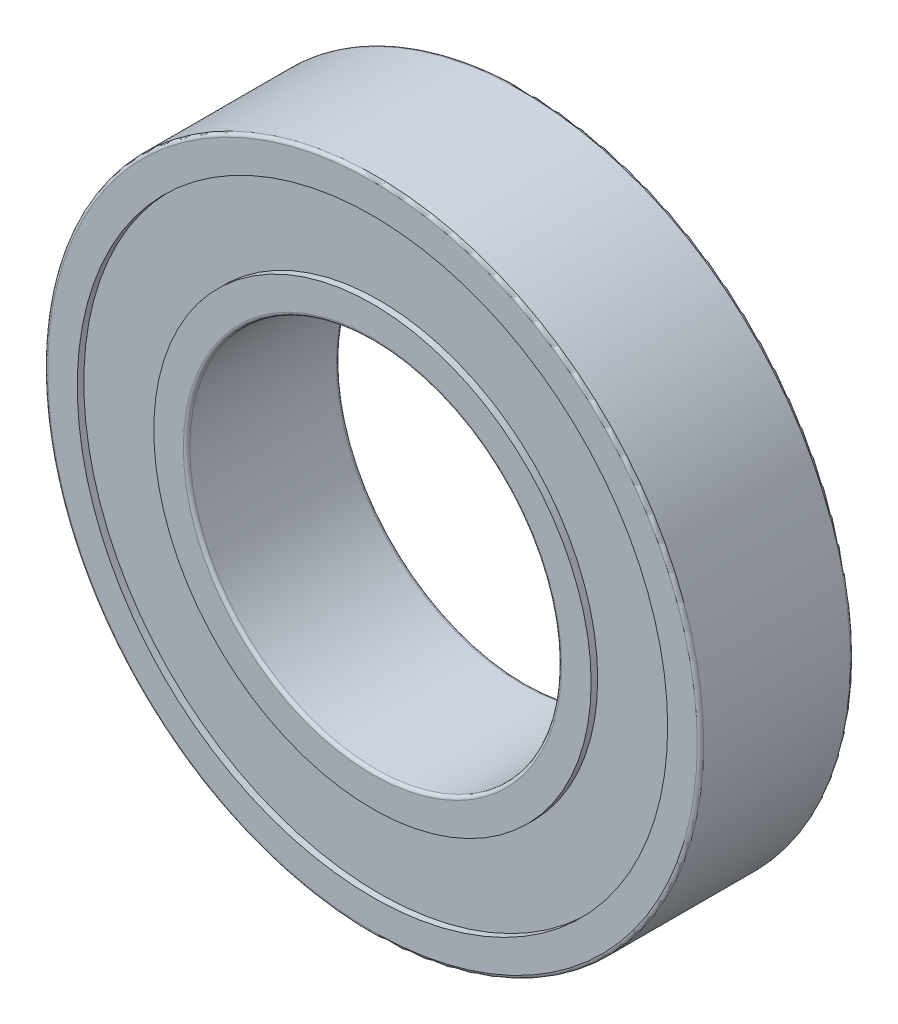
ISO-10303-21;
HEADER;
FILE_DESCRIPTION(('STEP AP214'),'2;1');
FILE_NAME('part.step','',(''),(''),'','','');
FILE_SCHEMA(('AUTOMOTIVE_DESIGN { 1 0 10303 214 1 1 1 1 }'));
ENDSEC;
DATA;
#1=APPLICATION_CONTEXT('core data for automotive mechanical design processes');
#2=APPLICATION_PROTOCOL_DEFINITION('international standard','automotive_design',2000,#1);
#3=PRODUCT_CONTEXT('',#1,'mechanical');
#4=PRODUCT('Part','Part','',(#3));
#5=PRODUCT_RELATED_PRODUCT_CATEGORY('part','',(#4));
#6=PRODUCT_DEFINITION_FORMATION('','',#4);
#7=PRODUCT_DEFINITION_CONTEXT('part definition',#1,'design');
#8=PRODUCT_DEFINITION('design','',#6,#7);
#9=PRODUCT_DEFINITION_SHAPE('','',#8);
#10=(LENGTH_UNIT() NAMED_UNIT(*) SI_UNIT(.MILLI.,.METRE.));
#11=(NAMED_UNIT(*) PLANE_ANGLE_UNIT() SI_UNIT($,.RADIAN.));
#12=(NAMED_UNIT(*) SI_UNIT($,.STERADIAN.) SOLID_ANGLE_UNIT());
#13=UNCERTAINTY_MEASURE_WITH_UNIT(LENGTH_MEASURE(1.E-05),#10,'distance_accuracy_value','');
#14=(GEOMETRIC_REPRESENTATION_CONTEXT(3) GLOBAL_UNCERTAINTY_ASSIGNED_CONTEXT((#13)) GLOBAL_UNIT_ASSIGNED_CONTEXT((#10,
#11,#12)) REPRESENTATION_CONTEXT('',''));
#15=CARTESIAN_POINT('',(0.,0.,0.));
#16=DIRECTION('',(0.,0.,1.));
#17=DIRECTION('',(1.,0.,0.));
#18=AXIS2_PLACEMENT_3D('',#15,#16,#17);
#19=CARTESIAN_POINT('',(0.,0.,0.));
#20=DIRECTION('',(0.,0.,1.));
#21=DIRECTION('',(1.,0.,0.));
#22=AXIS2_PLACEMENT_3D('',#19,#20,#21);
#23=PLANE('',#22);
#24=CARTESIAN_POINT('',(0.,0.,0.));
#25=DIRECTION('',(0.,0.,1.));
#26=DIRECTION('',(1.,0.,0.));
#27=AXIS2_PLACEMENT_3D('',#24,#25,#26);
#28=CIRCLE('',#27,8.65);
#29=CARTESIAN_POINT('',(8.65,0.,0.));
#30=VERTEX_POINT('',#29);
#31=EDGE_CURVE('E62',#30,#30,#28,.T.);
#32=ORIENTED_EDGE('',*,*,#31,.T.);
#33=EDGE_LOOP('',(#32));
#34=FACE_BOUND('',#33,.T.);
#35=CARTESIAN_POINT('',(0.,0.,0.));
#36=DIRECTION('',(0.,0.,1.));
#37=DIRECTION('',(1.,0.,0.));
#38=AXIS2_PLACEMENT_3D('',#35,#36,#37);
#39=CIRCLE('',#38,10.);
#40=CARTESIAN_POINT('',(10.,0.,0.));
#41=VERTEX_POINT('',#40);
#42=EDGE_CURVE('E84',#41,#41,#39,.T.);
#43=ORIENTED_EDGE('',*,*,#42,.F.);
#44=EDGE_LOOP('',(#43));
#45=FACE_BOUND('',#44,.T.);
#46=ADVANCED_FACE('F33',(#34,#45),#23,.F.);
#47=CARTESIAN_POINT('',(0.,0.,7.));
#48=DIRECTION('',(0.,0.,1.));
#49=DIRECTION('',(1.,0.,0.));
#50=AXIS2_PLACEMENT_3D('',#47,#48,#49);
#51=PLANE('',#50);
#52=CARTESIAN_POINT('',(0.,0.,7.));
#53=DIRECTION('',(0.,0.,1.));
#54=DIRECTION('',(1.,0.,0.));
#55=AXIS2_PLACEMENT_3D('',#52,#53,#54);
#56=CIRCLE('',#55,8.65);
#57=CARTESIAN_POINT('',(8.65,0.,7.));
#58=VERTEX_POINT('',#57);
#59=EDGE_CURVE('E40',#58,#58,#56,.F.);
#60=ORIENTED_EDGE('',*,*,#59,.T.);
#61=EDGE_LOOP('',(#60));
#62=FACE_BOUND('',#61,.T.);
#63=CARTESIAN_POINT('',(0.,0.,7.));
#64=DIRECTION('',(0.,0.,1.));
#65=DIRECTION('',(1.,0.,0.));
#66=AXIS2_PLACEMENT_3D('',#63,#64,#65);
#67=CIRCLE('',#66,10.);
#68=CARTESIAN_POINT('',(10.,0.,7.));
#69=VERTEX_POINT('',#68);
#70=EDGE_CURVE('E72',#69,#69,#67,.T.);
#71=ORIENTED_EDGE('',*,*,#70,.T.);
#72=EDGE_LOOP('',(#71));
#73=FACE_BOUND('',#72,.T.);
#74=ADVANCED_FACE('F101',(#62,#73),#51,.T.);
#75=CARTESIAN_POINT('',(0.,0.,7.));
#76=DIRECTION('',(0.,0.,1.));
#77=DIRECTION('',(1.,0.,0.));
#78=AXIS2_PLACEMENT_3D('',#75,#76,#77);
#79=CIRCLE('',#78,14.85);
#80=CARTESIAN_POINT('',(14.85,0.,7.));
#81=VERTEX_POINT('',#80);
#82=EDGE_CURVE('E10',#81,#81,#79,.T.);
#83=ORIENTED_EDGE('',*,*,#82,.T.);
#84=EDGE_LOOP('',(#83));
#85=FACE_BOUND('',#84,.T.);
#86=CARTESIAN_POINT('',(0.,0.,7.));
#87=DIRECTION('',(0.,0.,1.));
#88=DIRECTION('',(1.,0.,0.));
#89=AXIS2_PLACEMENT_3D('',#86,#87,#88);
#90=CIRCLE('',#89,13.5);
#91=CARTESIAN_POINT('',(13.5,0.,7.));
#92=VERTEX_POINT('',#91);
#93=EDGE_CURVE('E66',#92,#92,#90,.T.);
#94=ORIENTED_EDGE('',*,*,#93,.F.);
#95=EDGE_LOOP('',(#94));
#96=FACE_BOUND('',#95,.T.);
#97=ADVANCED_FACE('F108',(#85,#96),#51,.T.);
#98=CARTESIAN_POINT('',(0.,0.,0.));
#99=DIRECTION('',(0.,0.,1.));
#100=DIRECTION('',(1.,0.,0.));
#101=AXIS2_PLACEMENT_3D('',#98,#99,#100);
#102=CIRCLE('',#101,14.85);
#103=CARTESIAN_POINT('',(14.85,0.,0.));
#104=VERTEX_POINT('',#103);
#105=EDGE_CURVE('E44',#104,#104,#102,.F.);
#106=ORIENTED_EDGE('',*,*,#105,.T.);
#107=EDGE_LOOP('',(#106));
#108=FACE_BOUND('',#107,.T.);
#109=CARTESIAN_POINT('',(0.,0.,0.));
#110=DIRECTION('',(0.,0.,1.));
#111=DIRECTION('',(1.,0.,0.));
#112=AXIS2_PLACEMENT_3D('',#109,#110,#111);
#113=CIRCLE('',#112,13.5);
#114=CARTESIAN_POINT('',(13.5,0.,0.));
#115=VERTEX_POINT('',#114);
#116=EDGE_CURVE('E78',#115,#115,#113,.T.);
#117=ORIENTED_EDGE('',*,*,#116,.T.);
#118=EDGE_LOOP('',(#117));
#119=FACE_BOUND('',#118,.T.);
#120=ADVANCED_FACE('F104',(#108,#119),#23,.F.);
#121=CARTESIAN_POINT('',(0.,0.,7.));
#122=DIRECTION('',(0.,0.,-1.));
#123=DIRECTION('',(-1.,0.,0.));
#124=AXIS2_PLACEMENT_3D('',#121,#122,#123);
#125=CYLINDRICAL_SURFACE('',#124,15.);
#126=CARTESIAN_POINT('',(0.,0.,0.15));
#127=DIRECTION('',(0.,0.,1.));
#128=DIRECTION('',(1.,0.,0.));
#129=AXIS2_PLACEMENT_3D('',#126,#127,#128);
#130=CIRCLE('',#129,15.);
#131=CARTESIAN_POINT('',(15.,0.,0.15));
#132=VERTEX_POINT('',#131);
#133=EDGE_CURVE('E48',#132,#132,#130,.T.);
#134=ORIENTED_EDGE('',*,*,#133,.T.);
#135=EDGE_LOOP('',(#134));
#136=FACE_BOUND('',#135,.T.);
#137=CARTESIAN_POINT('',(0.,0.,6.85));
#138=DIRECTION('',(0.,0.,1.));
#139=DIRECTION('',(1.,0.,0.));
#140=AXIS2_PLACEMENT_3D('',#137,#138,#139);
#141=CIRCLE('',#140,15.);
#142=CARTESIAN_POINT('',(15.,0.,6.85));
#143=VERTEX_POINT('',#142);
#144=EDGE_CURVE('E53',#143,#143,#141,.F.);
#145=ORIENTED_EDGE('',*,*,#144,.T.);
#146=EDGE_LOOP('',(#145));
#147=FACE_BOUND('',#146,.T.);
#148=ADVANCED_FACE('F112',(#136,#147),#125,.T.);
#149=CARTESIAN_POINT('',(0.,0.,7.));
#150=DIRECTION('',(0.,0.,-1.));
#151=DIRECTION('',(-1.,0.,0.));
#152=AXIS2_PLACEMENT_3D('',#149,#150,#151);
#153=CYLINDRICAL_SURFACE('',#152,8.5);
#154=CARTESIAN_POINT('',(0.,0.,0.15));
#155=DIRECTION('',(0.,0.,1.));
#156=DIRECTION('',(1.,0.,0.));
#157=AXIS2_PLACEMENT_3D('',#154,#155,#156);
#158=CIRCLE('',#157,8.5);
#159=CARTESIAN_POINT('',(8.5,0.,0.15));
#160=VERTEX_POINT('',#159);
#161=EDGE_CURVE('E56',#160,#160,#158,.F.);
#162=ORIENTED_EDGE('',*,*,#161,.T.);
#163=EDGE_LOOP('',(#162));
#164=FACE_BOUND('',#163,.T.);
#165=CARTESIAN_POINT('',(0.,0.,6.85));
#166=DIRECTION('',(0.,0.,1.));
#167=DIRECTION('',(1.,0.,0.));
#168=AXIS2_PLACEMENT_3D('',#165,#166,#167);
#169=CIRCLE('',#168,8.5);
#170=CARTESIAN_POINT('',(8.5,0.,6.85));
#171=VERTEX_POINT('',#170);
#172=EDGE_CURVE('E59',#171,#171,#169,.T.);
#173=ORIENTED_EDGE('',*,*,#172,.T.);
#174=EDGE_LOOP('',(#173));
#175=FACE_BOUND('',#174,.T.);
#176=ADVANCED_FACE('F118',(#164,#175),#153,.F.);
#177=CARTESIAN_POINT('',(0.,0.,6.7));
#178=DIRECTION('',(0.,0.,1.));
#179=DIRECTION('',(1.,0.,0.));
#180=AXIS2_PLACEMENT_3D('',#177,#178,#179);
#181=CYLINDRICAL_SURFACE('',#180,13.5);
#182=CARTESIAN_POINT('',(0.,0.,6.7));
#183=DIRECTION('',(0.,0.,1.));
#184=DIRECTION('',(1.,0.,0.));
#185=AXIS2_PLACEMENT_3D('',#182,#183,#184);
#186=CIRCLE('',#185,13.5);
#187=CARTESIAN_POINT('',(13.5,0.,6.7));
#188=VERTEX_POINT('',#187);
#189=EDGE_CURVE('E65',#188,#188,#186,.T.);
#190=ORIENTED_EDGE('',*,*,#189,.F.);
#191=EDGE_LOOP('',(#190));
#192=FACE_BOUND('',#191,.T.);
#193=ORIENTED_EDGE('',*,*,#93,.T.);
#194=EDGE_LOOP('',(#193));
#195=FACE_BOUND('',#194,.T.);
#196=ADVANCED_FACE('F140',(#192,#195),#181,.F.);
#197=CARTESIAN_POINT('',(0.,0.,6.7));
#198=DIRECTION('',(0.,0.,1.));
#199=DIRECTION('',(1.,0.,0.));
#200=AXIS2_PLACEMENT_3D('',#197,#198,#199);
#201=PLANE('',#200);
#202=CARTESIAN_POINT('',(0.,0.,6.7));
#203=DIRECTION('',(0.,0.,1.));
#204=DIRECTION('',(1.,0.,0.));
#205=AXIS2_PLACEMENT_3D('',#202,#203,#204);
#206=CIRCLE('',#205,10.);
#207=CARTESIAN_POINT('',(10.,0.,6.7));
#208=VERTEX_POINT('',#207);
#209=EDGE_CURVE('E69',#208,#208,#206,.T.);
#210=ORIENTED_EDGE('',*,*,#209,.F.);
#211=EDGE_LOOP('',(#210));
#212=FACE_BOUND('',#211,.T.);
#213=ORIENTED_EDGE('',*,*,#189,.T.);
#214=EDGE_LOOP('',(#213));
#215=FACE_BOUND('',#214,.T.);
#216=ADVANCED_FACE('F136',(#212,#215),#201,.T.);
#217=CARTESIAN_POINT('',(0.,0.,6.7));
#218=DIRECTION('',(0.,0.,1.));
#219=DIRECTION('',(1.,0.,0.));
#220=AXIS2_PLACEMENT_3D('',#217,#218,#219);
#221=CYLINDRICAL_SURFACE('',#220,10.);
#222=ORIENTED_EDGE('',*,*,#209,.T.);
#223=EDGE_LOOP('',(#222));
#224=FACE_BOUND('',#223,.T.);
#225=ORIENTED_EDGE('',*,*,#70,.F.);
#226=EDGE_LOOP('',(#225));
#227=FACE_BOUND('',#226,.T.);
#228=ADVANCED_FACE('F130',(#224,#227),#221,.T.);
#229=CARTESIAN_POINT('',(0.,0.,0.5));
#230=DIRECTION('',(0.,0.,1.));
#231=DIRECTION('',(1.,0.,0.));
#232=AXIS2_PLACEMENT_3D('',#229,#230,#231);
#233=PLANE('',#232);
#234=CARTESIAN_POINT('',(0.,0.,0.5));
#235=DIRECTION('',(0.,0.,1.));
#236=DIRECTION('',(1.,0.,0.));
#237=AXIS2_PLACEMENT_3D('',#234,#235,#236);
#238=CIRCLE('',#237,13.5);
#239=CARTESIAN_POINT('',(13.5,0.,0.5));
#240=VERTEX_POINT('',#239);
#241=EDGE_CURVE('E75',#240,#240,#238,.T.);
#242=ORIENTED_EDGE('',*,*,#241,.F.);
#243=EDGE_LOOP('',(#242));
#244=FACE_BOUND('',#243,.T.);
#245=CARTESIAN_POINT('',(0.,0.,0.5));
#246=DIRECTION('',(0.,0.,1.));
#247=DIRECTION('',(1.,0.,0.));
#248=AXIS2_PLACEMENT_3D('',#245,#246,#247);
#249=CIRCLE('',#248,10.);
#250=CARTESIAN_POINT('',(10.,0.,0.5));
#251=VERTEX_POINT('',#250);
#252=EDGE_CURVE('E81',#251,#251,#249,.T.);
#253=ORIENTED_EDGE('',*,*,#252,.T.);
#254=EDGE_LOOP('',(#253));
#255=FACE_BOUND('',#254,.T.);
#256=ADVANCED_FACE('F90',(#244,#255),#233,.F.);
#257=CARTESIAN_POINT('',(0.,0.,0.5));
#258=DIRECTION('',(0.,0.,-1.));
#259=DIRECTION('',(-1.,0.,0.));
#260=AXIS2_PLACEMENT_3D('',#257,#258,#259);
#261=CYLINDRICAL_SURFACE('',#260,13.5);
#262=ORIENTED_EDGE('',*,*,#241,.T.);
#263=EDGE_LOOP('',(#262));
#264=FACE_BOUND('',#263,.T.);
#265=ORIENTED_EDGE('',*,*,#116,.F.);
#266=EDGE_LOOP('',(#265));
#267=FACE_BOUND('',#266,.T.);
#268=ADVANCED_FACE('F96',(#264,#267),#261,.F.);
#269=CARTESIAN_POINT('',(0.,0.,0.5));
#270=DIRECTION('',(0.,0.,-1.));
#271=DIRECTION('',(-1.,0.,0.));
#272=AXIS2_PLACEMENT_3D('',#269,#270,#271);
#273=CYLINDRICAL_SURFACE('',#272,10.);
#274=ORIENTED_EDGE('',*,*,#252,.F.);
#275=EDGE_LOOP('',(#274));
#276=FACE_BOUND('',#275,.T.);
#277=ORIENTED_EDGE('',*,*,#42,.T.);
#278=EDGE_LOOP('',(#277));
#279=FACE_BOUND('',#278,.T.);
#280=ADVANCED_FACE('F92',(#276,#279),#273,.T.);
#281=CARTESIAN_POINT('',(0.,0.,0.15));
#282=DIRECTION('',(0.,0.,1.));
#283=DIRECTION('',(1.,0.,0.));
#284=AXIS2_PLACEMENT_3D('',#281,#282,#283);
#285=TOROIDAL_SURFACE('',#284,8.65,0.15);
#286=ORIENTED_EDGE('',*,*,#161,.F.);
#287=EDGE_LOOP('',(#286));
#288=FACE_BOUND('',#287,.T.);
#289=ORIENTED_EDGE('',*,*,#31,.F.);
#290=EDGE_LOOP('',(#289));
#291=FACE_BOUND('',#290,.T.);
#292=ADVANCED_FACE('F95',(#288,#291),#285,.T.);
#293=CARTESIAN_POINT('',(0.,0.,0.15));
#294=DIRECTION('',(0.,0.,1.));
#295=DIRECTION('',(1.,0.,0.));
#296=AXIS2_PLACEMENT_3D('',#293,#294,#295);
#297=TOROIDAL_SURFACE('',#296,14.85,0.15);
#298=ORIENTED_EDGE('',*,*,#105,.F.);
#299=EDGE_LOOP('',(#298));
#300=FACE_BOUND('',#299,.T.);
#301=ORIENTED_EDGE('',*,*,#133,.F.);
#302=EDGE_LOOP('',(#301));
#303=FACE_BOUND('',#302,.T.);
#304=ADVANCED_FACE('F155',(#300,#303),#297,.T.);
#305=CARTESIAN_POINT('',(0.,0.,6.85));
#306=DIRECTION('',(0.,0.,1.));
#307=DIRECTION('',(1.,0.,0.));
#308=AXIS2_PLACEMENT_3D('',#305,#306,#307);
#309=TOROIDAL_SURFACE('',#308,8.65,0.15);
#310=ORIENTED_EDGE('',*,*,#59,.F.);
#311=EDGE_LOOP('',(#310));
#312=FACE_BOUND('',#311,.T.);
#313=ORIENTED_EDGE('',*,*,#172,.F.);
#314=EDGE_LOOP('',(#313));
#315=FACE_BOUND('',#314,.T.);
#316=ADVANCED_FACE('F153',(#312,#315),#309,.T.);
#317=CARTESIAN_POINT('',(0.,0.,6.85));
#318=DIRECTION('',(0.,0.,1.));
#319=DIRECTION('',(1.,0.,0.));
#320=AXIS2_PLACEMENT_3D('',#317,#318,#319);
#321=TOROIDAL_SURFACE('',#320,14.85,0.15);
#322=ORIENTED_EDGE('',*,*,#144,.F.);
#323=EDGE_LOOP('',(#322));
#324=FACE_BOUND('',#323,.T.);
#325=ORIENTED_EDGE('',*,*,#82,.F.);
#326=EDGE_LOOP('',(#325));
#327=FACE_BOUND('',#326,.T.);
#328=ADVANCED_FACE('F35',(#324,#327),#321,.T.);
#329=CLOSED_SHELL('',(#46,#74,#97,#120,#148,#176,#196,#216,#228,#256,#268,#280,#292,#304,#316,#328));
#330=MANIFOLD_SOLID_BREP('B2',#329);
#331=ADVANCED_BREP_SHAPE_REPRESENTATION('',(#18,#330),#14);
#332=SHAPE_DEFINITION_REPRESENTATION(#9,#331);
ENDSEC;
END-ISO-10303-21;
